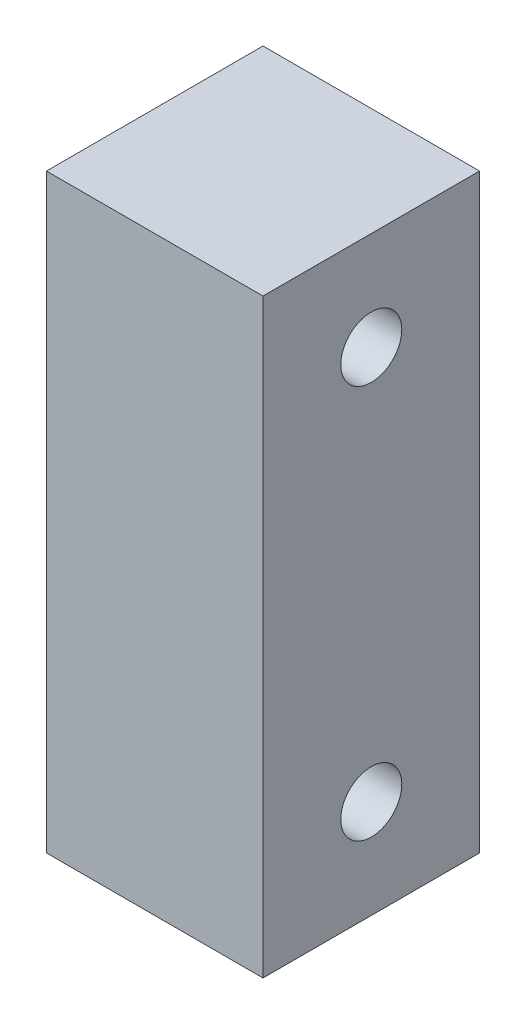
ISO-10303-21;
HEADER;
FILE_DESCRIPTION(('STEP AP214'),'2;1');
FILE_NAME('part.step','',(''),(''),'','','');
FILE_SCHEMA(('AUTOMOTIVE_DESIGN { 1 0 10303 214 1 1 1 1 }'));
ENDSEC;
DATA;
#1=APPLICATION_CONTEXT('core data for automotive mechanical design processes');
#2=APPLICATION_PROTOCOL_DEFINITION('international standard','automotive_design',2000,#1);
#3=PRODUCT_CONTEXT('',#1,'mechanical');
#4=PRODUCT('Part','Part','',(#3));
#5=PRODUCT_RELATED_PRODUCT_CATEGORY('part','',(#4));
#6=PRODUCT_DEFINITION_FORMATION('','',#4);
#7=PRODUCT_DEFINITION_CONTEXT('part definition',#1,'design');
#8=PRODUCT_DEFINITION('design','',#6,#7);
#9=PRODUCT_DEFINITION_SHAPE('','',#8);
#10=(LENGTH_UNIT() NAMED_UNIT(*) SI_UNIT(.MILLI.,.METRE.));
#11=(NAMED_UNIT(*) PLANE_ANGLE_UNIT() SI_UNIT($,.RADIAN.));
#12=(NAMED_UNIT(*) SI_UNIT($,.STERADIAN.) SOLID_ANGLE_UNIT());
#13=UNCERTAINTY_MEASURE_WITH_UNIT(LENGTH_MEASURE(1.E-05),#10,'distance_accuracy_value','');
#14=(GEOMETRIC_REPRESENTATION_CONTEXT(3) GLOBAL_UNCERTAINTY_ASSIGNED_CONTEXT((#13)) GLOBAL_UNIT_ASSIGNED_CONTEXT((#10,
#11,#12)) REPRESENTATION_CONTEXT('',''));
#15=CARTESIAN_POINT('',(0.,0.,0.));
#16=DIRECTION('',(0.,0.,1.));
#17=DIRECTION('',(1.,0.,0.));
#18=AXIS2_PLACEMENT_3D('',#15,#16,#17);
#19=CARTESIAN_POINT('',(-44.0621910112359,1.55132850098526,13.97));
#20=DIRECTION('',(1.,0.,0.));
#21=DIRECTION('',(0.,1.,0.));
#22=AXIS2_PLACEMENT_3D('',#19,#20,#21);
#23=PLANE('',#22);
#24=CARTESIAN_POINT('',(-44.0621910112359,-30.1986714990147,6.985));
#25=DIRECTION('',(-1.,0.,0.));
#26=DIRECTION('',(0.,-1.,0.));
#27=AXIS2_PLACEMENT_3D('',#24,#25,#26);
#28=CIRCLE('',#27,1.9685);
#29=CARTESIAN_POINT('',(-44.0621910112359,-32.1671714990147,6.985));
#30=VERTEX_POINT('',#29);
#31=EDGE_CURVE('E116',#30,#30,#28,.T.);
#32=ORIENTED_EDGE('',*,*,#31,.F.);
#33=EDGE_LOOP('',(#32));
#34=FACE_BOUND('',#33,.T.);
#35=CARTESIAN_POINT('',(-44.0621910112359,-4.79867149901474,6.985));
#36=DIRECTION('',(-1.,0.,0.));
#37=DIRECTION('',(0.,-1.,0.));
#38=AXIS2_PLACEMENT_3D('',#35,#36,#37);
#39=CIRCLE('',#38,1.9685);
#40=CARTESIAN_POINT('',(-44.0621910112359,-6.76717149901474,6.985));
#41=VERTEX_POINT('',#40);
#42=EDGE_CURVE('E110',#41,#41,#39,.T.);
#43=ORIENTED_EDGE('',*,*,#42,.F.);
#44=EDGE_LOOP('',(#43));
#45=FACE_BOUND('',#44,.T.);
#46=DIRECTION('',(0.,-1.,0.));
#47=VECTOR('',#46,1.);
#48=CARTESIAN_POINT('',(-44.0621910112359,1.55132850098526,0.));
#49=LINE('',#48,#47);
#50=CARTESIAN_POINT('',(-44.0621910112359,1.55132850098526,0.));
#51=VERTEX_POINT('',#50);
#52=CARTESIAN_POINT('',(-44.0621910112359,-36.5486714990147,0.));
#53=VERTEX_POINT('',#52);
#54=EDGE_CURVE('E96',#51,#53,#49,.T.);
#55=ORIENTED_EDGE('',*,*,#54,.T.);
#56=DIRECTION('',(0.,0.,-1.));
#57=VECTOR('',#56,1.);
#58=CARTESIAN_POINT('',(-44.0621910112359,-36.5486714990147,13.97));
#59=LINE('',#58,#57);
#60=CARTESIAN_POINT('',(-44.0621910112359,-36.5486714990147,13.97));
#61=VERTEX_POINT('',#60);
#62=EDGE_CURVE('E11',#61,#53,#59,.T.);
#63=ORIENTED_EDGE('',*,*,#62,.F.);
#64=DIRECTION('',(0.,-1.,0.));
#65=VECTOR('',#64,1.);
#66=CARTESIAN_POINT('',(-44.0621910112359,1.55132850098526,13.97));
#67=LINE('',#66,#65);
#68=CARTESIAN_POINT('',(-44.0621910112359,1.55132850098526,13.97));
#69=VERTEX_POINT('',#68);
#70=EDGE_CURVE('E84',#69,#61,#67,.T.);
#71=ORIENTED_EDGE('',*,*,#70,.F.);
#72=DIRECTION('',(0.,0.,-1.));
#73=VECTOR('',#72,1.);
#74=CARTESIAN_POINT('',(-44.0621910112359,1.55132850098526,13.97));
#75=LINE('',#74,#73);
#76=EDGE_CURVE('E92',#69,#51,#75,.T.);
#77=ORIENTED_EDGE('',*,*,#76,.T.);
#78=EDGE_LOOP('',(#55,#63,#71,#77));
#79=FACE_BOUND('',#78,.T.);
#80=ADVANCED_FACE('F33',(#34,#45,#79),#23,.F.);
#81=CARTESIAN_POINT('',(-30.0921910112359,-36.5486714990147,13.97));
#82=DIRECTION('',(0.,1.,0.));
#83=DIRECTION('',(0.,0.,1.));
#84=AXIS2_PLACEMENT_3D('',#81,#82,#83);
#85=PLANE('',#84);
#86=DIRECTION('',(1.,0.,0.));
#87=VECTOR('',#86,1.);
#88=CARTESIAN_POINT('',(-30.0921910112359,-36.5486714990147,0.));
#89=LINE('',#88,#87);
#90=CARTESIAN_POINT('',(-30.0921910112359,-36.5486714990147,0.));
#91=VERTEX_POINT('',#90);
#92=EDGE_CURVE('E88',#53,#91,#89,.T.);
#93=ORIENTED_EDGE('',*,*,#92,.T.);
#94=DIRECTION('',(0.,0.,-1.));
#95=VECTOR('',#94,1.);
#96=CARTESIAN_POINT('',(-30.0921910112359,-36.5486714990147,13.97));
#97=LINE('',#96,#95);
#98=CARTESIAN_POINT('',(-30.0921910112359,-36.5486714990147,13.97));
#99=VERTEX_POINT('',#98);
#100=EDGE_CURVE('E41',#99,#91,#97,.T.);
#101=ORIENTED_EDGE('',*,*,#100,.F.);
#102=DIRECTION('',(1.,0.,0.));
#103=VECTOR('',#102,1.);
#104=CARTESIAN_POINT('',(-30.0921910112359,-36.5486714990147,13.97));
#105=LINE('',#104,#103);
#106=EDGE_CURVE('E79',#61,#99,#105,.T.);
#107=ORIENTED_EDGE('',*,*,#106,.F.);
#108=ORIENTED_EDGE('',*,*,#62,.T.);
#109=EDGE_LOOP('',(#93,#101,#107,#108));
#110=FACE_BOUND('',#109,.T.);
#111=ADVANCED_FACE('F87',(#110),#85,.F.);
#112=CARTESIAN_POINT('',(-30.0921910112359,1.55132850098526,13.97));
#113=DIRECTION('',(-1.,0.,0.));
#114=DIRECTION('',(0.,0.,1.));
#115=AXIS2_PLACEMENT_3D('',#112,#113,#114);
#116=PLANE('',#115);
#117=CARTESIAN_POINT('',(-30.0921910112359,-30.1986714990147,6.985));
#118=DIRECTION('',(-1.,0.,0.));
#119=DIRECTION('',(0.,-1.,0.));
#120=AXIS2_PLACEMENT_3D('',#117,#118,#119);
#121=CIRCLE('',#120,1.9685);
#122=CARTESIAN_POINT('',(-30.0921910112359,-32.1671714990147,6.985));
#123=VERTEX_POINT('',#122);
#124=EDGE_CURVE('E113',#123,#123,#121,.T.);
#125=ORIENTED_EDGE('',*,*,#124,.T.);
#126=EDGE_LOOP('',(#125));
#127=FACE_BOUND('',#126,.T.);
#128=CARTESIAN_POINT('',(-30.0921910112359,-4.79867149901474,6.985));
#129=DIRECTION('',(-1.,0.,0.));
#130=DIRECTION('',(0.,-1.,0.));
#131=AXIS2_PLACEMENT_3D('',#128,#129,#130);
#132=CIRCLE('',#131,1.9685);
#133=CARTESIAN_POINT('',(-30.0921910112359,-6.76717149901474,6.985));
#134=VERTEX_POINT('',#133);
#135=EDGE_CURVE('E99',#134,#134,#132,.T.);
#136=ORIENTED_EDGE('',*,*,#135,.T.);
#137=EDGE_LOOP('',(#136));
#138=FACE_BOUND('',#137,.T.);
#139=DIRECTION('',(0.,1.,0.));
#140=VECTOR('',#139,1.);
#141=CARTESIAN_POINT('',(-30.0921910112359,1.55132850098526,0.));
#142=LINE('',#141,#140);
#143=CARTESIAN_POINT('',(-30.0921910112359,1.55132850098526,0.));
#144=VERTEX_POINT('',#143);
#145=EDGE_CURVE('E66',#91,#144,#142,.T.);
#146=ORIENTED_EDGE('',*,*,#145,.T.);
#147=DIRECTION('',(0.,0.,-1.));
#148=VECTOR('',#147,1.);
#149=CARTESIAN_POINT('',(-30.0921910112359,1.55132850098526,13.97));
#150=LINE('',#149,#148);
#151=CARTESIAN_POINT('',(-30.0921910112359,1.55132850098526,13.97));
#152=VERTEX_POINT('',#151);
#153=EDGE_CURVE('E89',#152,#144,#150,.T.);
#154=ORIENTED_EDGE('',*,*,#153,.F.);
#155=DIRECTION('',(0.,1.,0.));
#156=VECTOR('',#155,1.);
#157=CARTESIAN_POINT('',(-30.0921910112359,1.55132850098526,13.97));
#158=LINE('',#157,#156);
#159=EDGE_CURVE('E82',#99,#152,#158,.T.);
#160=ORIENTED_EDGE('',*,*,#159,.F.);
#161=ORIENTED_EDGE('',*,*,#100,.T.);
#162=EDGE_LOOP('',(#146,#154,#160,#161));
#163=FACE_BOUND('',#162,.T.);
#164=ADVANCED_FACE('F90',(#127,#138,#163),#116,.F.);
#165=CARTESIAN_POINT('',(-44.0621910112359,1.55132850098526,13.97));
#166=DIRECTION('',(0.,-1.,0.));
#167=DIRECTION('',(0.,0.,-1.));
#168=AXIS2_PLACEMENT_3D('',#165,#166,#167);
#169=PLANE('',#168);
#170=DIRECTION('',(-1.,0.,0.));
#171=VECTOR('',#170,1.);
#172=CARTESIAN_POINT('',(-44.0621910112359,1.55132850098526,0.));
#173=LINE('',#172,#171);
#174=EDGE_CURVE('E72',#144,#51,#173,.T.);
#175=ORIENTED_EDGE('',*,*,#174,.T.);
#176=ORIENTED_EDGE('',*,*,#76,.F.);
#177=DIRECTION('',(-1.,0.,0.));
#178=VECTOR('',#177,1.);
#179=CARTESIAN_POINT('',(-44.0621910112359,1.55132850098526,13.97));
#180=LINE('',#179,#178);
#181=EDGE_CURVE('E49',#152,#69,#180,.T.);
#182=ORIENTED_EDGE('',*,*,#181,.F.);
#183=ORIENTED_EDGE('',*,*,#153,.T.);
#184=EDGE_LOOP('',(#175,#176,#182,#183));
#185=FACE_BOUND('',#184,.T.);
#186=ADVANCED_FACE('F104',(#185),#169,.F.);
#187=CARTESIAN_POINT('',(0.,0.,13.97));
#188=DIRECTION('',(0.,0.,-1.));
#189=DIRECTION('',(-1.,0.,0.));
#190=AXIS2_PLACEMENT_3D('',#187,#188,#189);
#191=PLANE('',#190);
#192=ORIENTED_EDGE('',*,*,#70,.T.);
#193=ORIENTED_EDGE('',*,*,#106,.T.);
#194=ORIENTED_EDGE('',*,*,#159,.T.);
#195=ORIENTED_EDGE('',*,*,#181,.T.);
#196=EDGE_LOOP('',(#192,#193,#194,#195));
#197=FACE_BOUND('',#196,.T.);
#198=ADVANCED_FACE('F80',(#197),#191,.F.);
#199=CARTESIAN_POINT('',(0.,0.,0.));
#200=DIRECTION('',(0.,0.,-1.));
#201=DIRECTION('',(-1.,0.,0.));
#202=AXIS2_PLACEMENT_3D('',#199,#200,#201);
#203=PLANE('',#202);
#204=ORIENTED_EDGE('',*,*,#54,.F.);
#205=ORIENTED_EDGE('',*,*,#174,.F.);
#206=ORIENTED_EDGE('',*,*,#145,.F.);
#207=ORIENTED_EDGE('',*,*,#92,.F.);
#208=EDGE_LOOP('',(#204,#205,#206,#207));
#209=FACE_BOUND('',#208,.T.);
#210=ADVANCED_FACE('F107',(#209),#203,.T.);
#211=CARTESIAN_POINT('',(-30.0921910112359,-4.79867149901474,6.985));
#212=DIRECTION('',(-1.,0.,0.));
#213=DIRECTION('',(0.,-1.,0.));
#214=AXIS2_PLACEMENT_3D('',#211,#212,#213);
#215=CYLINDRICAL_SURFACE('',#214,1.9685);
#216=ORIENTED_EDGE('',*,*,#135,.F.);
#217=EDGE_LOOP('',(#216));
#218=FACE_BOUND('',#217,.T.);
#219=ORIENTED_EDGE('',*,*,#42,.T.);
#220=EDGE_LOOP('',(#219));
#221=FACE_BOUND('',#220,.T.);
#222=ADVANCED_FACE('F127',(#218,#221),#215,.F.);
#223=CARTESIAN_POINT('',(-30.0921910112359,-30.1986714990147,6.985));
#224=DIRECTION('',(-1.,0.,0.));
#225=DIRECTION('',(0.,-1.,0.));
#226=AXIS2_PLACEMENT_3D('',#223,#224,#225);
#227=CYLINDRICAL_SURFACE('',#226,1.9685);
#228=ORIENTED_EDGE('',*,*,#124,.F.);
#229=EDGE_LOOP('',(#228));
#230=FACE_BOUND('',#229,.T.);
#231=ORIENTED_EDGE('',*,*,#31,.T.);
#232=EDGE_LOOP('',(#231));
#233=FACE_BOUND('',#232,.T.);
#234=ADVANCED_FACE('F124',(#230,#233),#227,.F.);
#235=CLOSED_SHELL('',(#80,#111,#164,#186,#198,#210,#222,#234));
#236=MANIFOLD_SOLID_BREP('B2',#235);
#237=ADVANCED_BREP_SHAPE_REPRESENTATION('',(#18,#236),#14);
#238=SHAPE_DEFINITION_REPRESENTATION(#9,#237);
ENDSEC;
END-ISO-10303-21;
